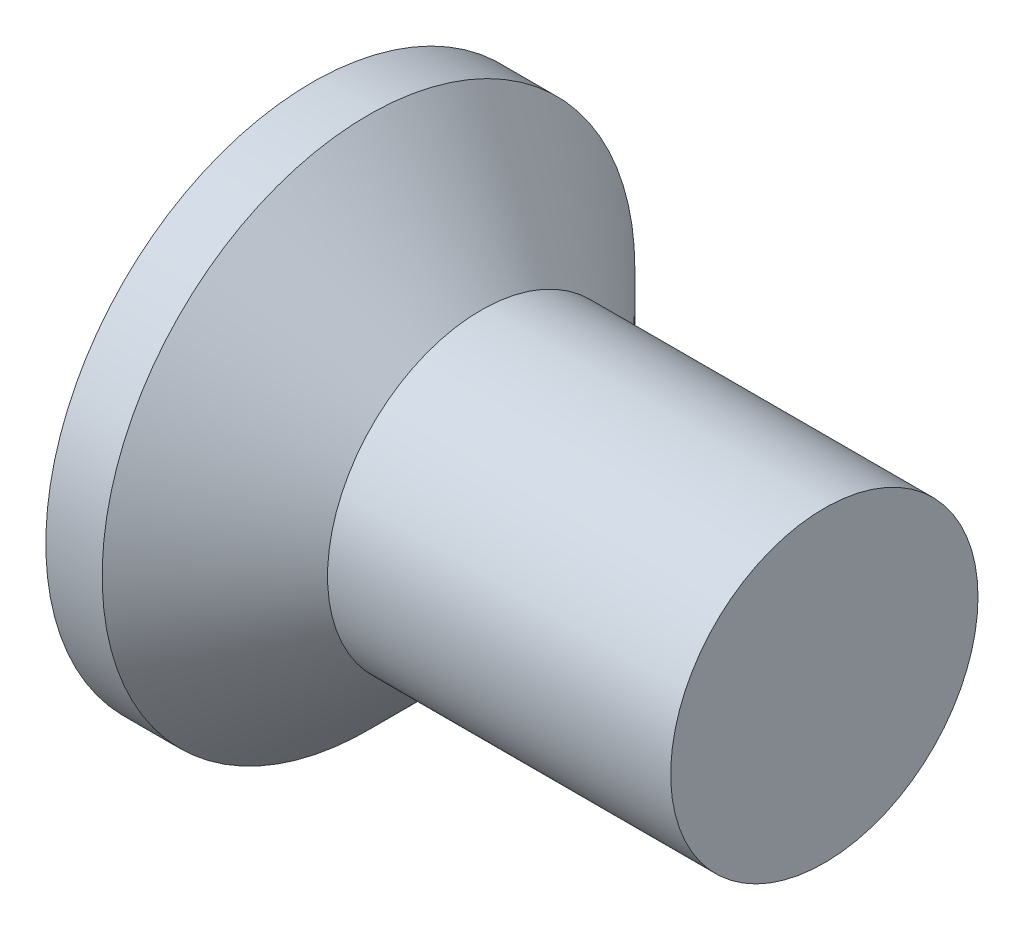
ISO-10303-21;
HEADER;
FILE_DESCRIPTION(('STEP AP214'),'2;1');
FILE_NAME('part.step','',(''),(''),'','','');
FILE_SCHEMA(('AUTOMOTIVE_DESIGN { 1 0 10303 214 1 1 1 1 }'));
ENDSEC;
DATA;
#1=APPLICATION_CONTEXT('core data for automotive mechanical design processes');
#2=APPLICATION_PROTOCOL_DEFINITION('international standard','automotive_design',2000,#1);
#3=PRODUCT_CONTEXT('',#1,'mechanical');
#4=PRODUCT('Part','Part','',(#3));
#5=PRODUCT_RELATED_PRODUCT_CATEGORY('part','',(#4));
#6=PRODUCT_DEFINITION_FORMATION('','',#4);
#7=PRODUCT_DEFINITION_CONTEXT('part definition',#1,'design');
#8=PRODUCT_DEFINITION('design','',#6,#7);
#9=PRODUCT_DEFINITION_SHAPE('','',#8);
#10=(LENGTH_UNIT() NAMED_UNIT(*) SI_UNIT(.MILLI.,.METRE.));
#11=(NAMED_UNIT(*) PLANE_ANGLE_UNIT() SI_UNIT($,.RADIAN.));
#12=(NAMED_UNIT(*) SI_UNIT($,.STERADIAN.) SOLID_ANGLE_UNIT());
#13=UNCERTAINTY_MEASURE_WITH_UNIT(LENGTH_MEASURE(1.E-05),#10,'distance_accuracy_value','');
#14=(GEOMETRIC_REPRESENTATION_CONTEXT(3) GLOBAL_UNCERTAINTY_ASSIGNED_CONTEXT((#13)) GLOBAL_UNIT_ASSIGNED_CONTEXT((#10,
#11,#12)) REPRESENTATION_CONTEXT('',''));
#15=CARTESIAN_POINT('',(0.,0.,0.));
#16=DIRECTION('',(0.,0.,1.));
#17=DIRECTION('',(1.,0.,0.));
#18=AXIS2_PLACEMENT_3D('',#15,#16,#17);
#19=CARTESIAN_POINT('',(0.825,0.62,0.62));
#20=DIRECTION('',(-1.,0.,0.));
#21=DIRECTION('',(0.,0.,1.));
#22=AXIS2_PLACEMENT_3D('',#19,#20,#21);
#23=CYLINDRICAL_SURFACE('',#22,0.3);
#24=CARTESIAN_POINT('',(0.825,0.62,0.62));
#25=DIRECTION('',(1.,0.,0.));
#26=DIRECTION('',(0.,0.,1.));
#27=AXIS2_PLACEMENT_3D('',#24,#25,#26);
#28=CIRCLE('',#27,0.3);
#29=CARTESIAN_POINT('',(0.825,0.32,0.62));
#30=VERTEX_POINT('',#29);
#31=CARTESIAN_POINT('',(0.825,0.62,0.32));
#32=VERTEX_POINT('',#31);
#33=EDGE_CURVE('E39',#30,#32,#28,.T.);
#34=ORIENTED_EDGE('',*,*,#33,.F.);
#35=DIRECTION('',(1.,0.,0.));
#36=VECTOR('',#35,1.);
#37=CARTESIAN_POINT('',(0.825,0.32,0.62));
#38=LINE('',#37,#36);
#39=CARTESIAN_POINT('',(0.,0.32,0.62));
#40=VERTEX_POINT('',#39);
#41=EDGE_CURVE('E224',#40,#30,#38,.T.);
#42=ORIENTED_EDGE('',*,*,#41,.F.);
#43=CARTESIAN_POINT('',(0.,0.62,0.62));
#44=DIRECTION('',(-1.,0.,0.));
#45=DIRECTION('',(0.,0.,1.));
#46=AXIS2_PLACEMENT_3D('',#43,#44,#45);
#47=CIRCLE('',#46,0.3);
#48=CARTESIAN_POINT('',(0.,0.62,0.32));
#49=VERTEX_POINT('',#48);
#50=EDGE_CURVE('E326',#49,#40,#47,.T.);
#51=ORIENTED_EDGE('',*,*,#50,.F.);
#52=DIRECTION('',(-1.,0.,0.));
#53=VECTOR('',#52,1.);
#54=CARTESIAN_POINT('',(0.825,0.62,0.32));
#55=LINE('',#54,#53);
#56=EDGE_CURVE('E198',#32,#49,#55,.T.);
#57=ORIENTED_EDGE('',*,*,#56,.F.);
#58=EDGE_LOOP('',(#34,#42,#51,#57));
#59=FACE_BOUND('',#58,.T.);
#60=ADVANCED_FACE('F17',(#59),#23,.T.);
#61=CARTESIAN_POINT('',(0.825,0.62,-0.62));
#62=DIRECTION('',(-1.,0.,0.));
#63=DIRECTION('',(0.,0.,1.));
#64=AXIS2_PLACEMENT_3D('',#61,#62,#63);
#65=CYLINDRICAL_SURFACE('',#64,0.3);
#66=CARTESIAN_POINT('',(0.825,0.62,-0.62));
#67=DIRECTION('',(1.,0.,0.));
#68=DIRECTION('',(0.,0.,1.));
#69=AXIS2_PLACEMENT_3D('',#66,#67,#68);
#70=CIRCLE('',#69,0.3);
#71=CARTESIAN_POINT('',(0.825,0.62,-0.32));
#72=VERTEX_POINT('',#71);
#73=CARTESIAN_POINT('',(0.825,0.32,-0.62));
#74=VERTEX_POINT('',#73);
#75=EDGE_CURVE('E202',#72,#74,#70,.T.);
#76=ORIENTED_EDGE('',*,*,#75,.F.);
#77=DIRECTION('',(1.,0.,0.));
#78=VECTOR('',#77,1.);
#79=CARTESIAN_POINT('',(0.825,0.62,-0.32));
#80=LINE('',#79,#78);
#81=CARTESIAN_POINT('',(0.,0.62,-0.32));
#82=VERTEX_POINT('',#81);
#83=EDGE_CURVE('E186',#82,#72,#80,.T.);
#84=ORIENTED_EDGE('',*,*,#83,.F.);
#85=CARTESIAN_POINT('',(0.,0.62,-0.62));
#86=DIRECTION('',(-1.,0.,0.));
#87=DIRECTION('',(0.,0.,1.));
#88=AXIS2_PLACEMENT_3D('',#85,#86,#87);
#89=CIRCLE('',#88,0.3);
#90=CARTESIAN_POINT('',(0.,0.32,-0.62));
#91=VERTEX_POINT('',#90);
#92=EDGE_CURVE('E304',#91,#82,#89,.T.);
#93=ORIENTED_EDGE('',*,*,#92,.F.);
#94=DIRECTION('',(-1.,0.,0.));
#95=VECTOR('',#94,1.);
#96=CARTESIAN_POINT('',(0.825,0.32,-0.62));
#97=LINE('',#96,#95);
#98=EDGE_CURVE('E192',#74,#91,#97,.T.);
#99=ORIENTED_EDGE('',*,*,#98,.F.);
#100=EDGE_LOOP('',(#76,#84,#93,#99));
#101=FACE_BOUND('',#100,.T.);
#102=ADVANCED_FACE('F390',(#101),#65,.T.);
#103=CARTESIAN_POINT('',(0.825,-0.62,0.62));
#104=DIRECTION('',(-1.,0.,0.));
#105=DIRECTION('',(0.,0.,1.));
#106=AXIS2_PLACEMENT_3D('',#103,#104,#105);
#107=CYLINDRICAL_SURFACE('',#106,0.3);
#108=CARTESIAN_POINT('',(0.825,-0.62,0.62));
#109=DIRECTION('',(1.,0.,0.));
#110=DIRECTION('',(0.,0.,1.));
#111=AXIS2_PLACEMENT_3D('',#108,#109,#110);
#112=CIRCLE('',#111,0.3);
#113=CARTESIAN_POINT('',(0.825,-0.62,0.32));
#114=VERTEX_POINT('',#113);
#115=CARTESIAN_POINT('',(0.825,-0.32,0.62));
#116=VERTEX_POINT('',#115);
#117=EDGE_CURVE('E11',#114,#116,#112,.T.);
#118=ORIENTED_EDGE('',*,*,#117,.F.);
#119=DIRECTION('',(1.,0.,0.));
#120=VECTOR('',#119,1.);
#121=CARTESIAN_POINT('',(0.825,-0.62,0.32));
#122=LINE('',#121,#120);
#123=CARTESIAN_POINT('',(0.,-0.62,0.32));
#124=VERTEX_POINT('',#123);
#125=EDGE_CURVE('E236',#124,#114,#122,.T.);
#126=ORIENTED_EDGE('',*,*,#125,.F.);
#127=CARTESIAN_POINT('',(0.,-0.62,0.62));
#128=DIRECTION('',(-1.,0.,0.));
#129=DIRECTION('',(0.,0.,1.));
#130=AXIS2_PLACEMENT_3D('',#127,#128,#129);
#131=CIRCLE('',#130,0.3);
#132=CARTESIAN_POINT('',(0.,-0.32,0.62));
#133=VERTEX_POINT('',#132);
#134=EDGE_CURVE('E358',#133,#124,#131,.T.);
#135=ORIENTED_EDGE('',*,*,#134,.F.);
#136=DIRECTION('',(-1.,0.,0.));
#137=VECTOR('',#136,1.);
#138=CARTESIAN_POINT('',(0.825,-0.32,0.62));
#139=LINE('',#138,#137);
#140=EDGE_CURVE('E233',#116,#133,#139,.T.);
#141=ORIENTED_EDGE('',*,*,#140,.F.);
#142=EDGE_LOOP('',(#118,#126,#135,#141));
#143=FACE_BOUND('',#142,.T.);
#144=ADVANCED_FACE('F392',(#143),#107,.T.);
#145=CARTESIAN_POINT('',(0.825,-0.62,-0.62));
#146=DIRECTION('',(-1.,0.,0.));
#147=DIRECTION('',(0.,0.,1.));
#148=AXIS2_PLACEMENT_3D('',#145,#146,#147);
#149=CYLINDRICAL_SURFACE('',#148,0.3);
#150=CARTESIAN_POINT('',(0.825,-0.62,-0.62));
#151=DIRECTION('',(1.,0.,0.));
#152=DIRECTION('',(0.,0.,1.));
#153=AXIS2_PLACEMENT_3D('',#150,#151,#152);
#154=CIRCLE('',#153,0.3);
#155=CARTESIAN_POINT('',(0.825,-0.32,-0.62));
#156=VERTEX_POINT('',#155);
#157=CARTESIAN_POINT('',(0.825,-0.62,-0.32));
#158=VERTEX_POINT('',#157);
#159=EDGE_CURVE('E26',#156,#158,#154,.T.);
#160=ORIENTED_EDGE('',*,*,#159,.F.);
#161=DIRECTION('',(1.,0.,0.));
#162=VECTOR('',#161,1.);
#163=CARTESIAN_POINT('',(0.825,-0.32,-0.62));
#164=LINE('',#163,#162);
#165=CARTESIAN_POINT('',(0.,-0.32,-0.62));
#166=VERTEX_POINT('',#165);
#167=EDGE_CURVE('E219',#166,#156,#164,.T.);
#168=ORIENTED_EDGE('',*,*,#167,.F.);
#169=CARTESIAN_POINT('',(0.,-0.62,-0.62));
#170=DIRECTION('',(-1.,0.,0.));
#171=DIRECTION('',(0.,0.,1.));
#172=AXIS2_PLACEMENT_3D('',#169,#170,#171);
#173=CIRCLE('',#172,0.3);
#174=CARTESIAN_POINT('',(0.,-0.62,-0.32));
#175=VERTEX_POINT('',#174);
#176=EDGE_CURVE('E312',#175,#166,#173,.T.);
#177=ORIENTED_EDGE('',*,*,#176,.F.);
#178=DIRECTION('',(-1.,0.,0.));
#179=VECTOR('',#178,1.);
#180=CARTESIAN_POINT('',(0.825,-0.62,-0.32));
#181=LINE('',#180,#179);
#182=EDGE_CURVE('E223',#158,#175,#181,.T.);
#183=ORIENTED_EDGE('',*,*,#182,.F.);
#184=EDGE_LOOP('',(#160,#168,#177,#183));
#185=FACE_BOUND('',#184,.T.);
#186=ADVANCED_FACE('F398',(#185),#149,.T.);
#187=CARTESIAN_POINT('',(0.825,0.32,0.32));
#188=DIRECTION('',(-1.,0.,0.));
#189=DIRECTION('',(0.,0.,1.));
#190=AXIS2_PLACEMENT_3D('',#187,#188,#189);
#191=PLANE('',#190);
#192=DIRECTION('',(0.,0.,1.));
#193=VECTOR('',#192,1.);
#194=CARTESIAN_POINT('',(0.825,0.32,0.32));
#195=LINE('',#194,#193);
#196=CARTESIAN_POINT('',(0.825,0.32,1.12368602791856));
#197=VERTEX_POINT('',#196);
#198=EDGE_CURVE('E228',#30,#197,#195,.T.);
#199=ORIENTED_EDGE('',*,*,#198,.F.);
#200=ORIENTED_EDGE('',*,*,#33,.T.);
#201=DIRECTION('',(0.,-1.,0.));
#202=VECTOR('',#201,1.);
#203=CARTESIAN_POINT('',(0.825,0.32,0.32));
#204=LINE('',#203,#202);
#205=CARTESIAN_POINT('',(0.825,1.12368602791856,0.32));
#206=VERTEX_POINT('',#205);
#207=EDGE_CURVE('E169',#206,#32,#204,.T.);
#208=ORIENTED_EDGE('',*,*,#207,.F.);
#209=DIRECTION('',(0.,0.,1.));
#210=VECTOR('',#209,1.);
#211=CARTESIAN_POINT('',(0.825,1.12368602791856,0.32));
#212=LINE('',#211,#210);
#213=CARTESIAN_POINT('',(0.825,1.12368602791856,-0.32));
#214=VERTEX_POINT('',#213);
#215=EDGE_CURVE('E162',#214,#206,#212,.T.);
#216=ORIENTED_EDGE('',*,*,#215,.F.);
#217=DIRECTION('',(0.,1.,0.));
#218=VECTOR('',#217,1.);
#219=CARTESIAN_POINT('',(0.825,0.32,-0.32));
#220=LINE('',#219,#218);
#221=EDGE_CURVE('E166',#72,#214,#220,.T.);
#222=ORIENTED_EDGE('',*,*,#221,.F.);
#223=ORIENTED_EDGE('',*,*,#75,.T.);
#224=DIRECTION('',(0.,0.,1.));
#225=VECTOR('',#224,1.);
#226=CARTESIAN_POINT('',(0.825,0.32,-0.32));
#227=LINE('',#226,#225);
#228=CARTESIAN_POINT('',(0.825,0.32,-1.12368602791856));
#229=VERTEX_POINT('',#228);
#230=EDGE_CURVE('E281',#229,#74,#227,.T.);
#231=ORIENTED_EDGE('',*,*,#230,.F.);
#232=DIRECTION('',(0.,1.,0.));
#233=VECTOR('',#232,1.);
#234=CARTESIAN_POINT('',(0.825,0.32,-1.12368602791856));
#235=LINE('',#234,#233);
#236=CARTESIAN_POINT('',(0.825,-0.32,-1.12368602791856));
#237=VERTEX_POINT('',#236);
#238=EDGE_CURVE('E276',#237,#229,#235,.T.);
#239=ORIENTED_EDGE('',*,*,#238,.F.);
#240=DIRECTION('',(0.,0.,-1.));
#241=VECTOR('',#240,1.);
#242=CARTESIAN_POINT('',(0.825,-0.32,-0.32));
#243=LINE('',#242,#241);
#244=EDGE_CURVE('E222',#156,#237,#243,.T.);
#245=ORIENTED_EDGE('',*,*,#244,.F.);
#246=ORIENTED_EDGE('',*,*,#159,.T.);
#247=DIRECTION('',(0.,1.,0.));
#248=VECTOR('',#247,1.);
#249=CARTESIAN_POINT('',(0.825,-0.32,-0.32));
#250=LINE('',#249,#248);
#251=CARTESIAN_POINT('',(0.825,-1.12368602791856,-0.32));
#252=VERTEX_POINT('',#251);
#253=EDGE_CURVE('E264',#252,#158,#250,.T.);
#254=ORIENTED_EDGE('',*,*,#253,.F.);
#255=DIRECTION('',(0.,0.,-1.));
#256=VECTOR('',#255,1.);
#257=CARTESIAN_POINT('',(0.825,-1.12368602791856,0.32));
#258=LINE('',#257,#256);
#259=CARTESIAN_POINT('',(0.825,-1.12368602791856,0.32));
#260=VERTEX_POINT('',#259);
#261=EDGE_CURVE('E257',#260,#252,#258,.T.);
#262=ORIENTED_EDGE('',*,*,#261,.F.);
#263=DIRECTION('',(0.,-1.,0.));
#264=VECTOR('',#263,1.);
#265=CARTESIAN_POINT('',(0.825,-0.32,0.32));
#266=LINE('',#265,#264);
#267=EDGE_CURVE('E250',#114,#260,#266,.T.);
#268=ORIENTED_EDGE('',*,*,#267,.F.);
#269=ORIENTED_EDGE('',*,*,#117,.T.);
#270=DIRECTION('',(0.,0.,-1.));
#271=VECTOR('',#270,1.);
#272=CARTESIAN_POINT('',(0.825,-0.32,0.32));
#273=LINE('',#272,#271);
#274=CARTESIAN_POINT('',(0.825,-0.32,1.12368602791856));
#275=VERTEX_POINT('',#274);
#276=EDGE_CURVE('E237',#275,#116,#273,.T.);
#277=ORIENTED_EDGE('',*,*,#276,.F.);
#278=DIRECTION('',(0.,-1.,0.));
#279=VECTOR('',#278,1.);
#280=CARTESIAN_POINT('',(0.825,0.32,1.12368602791856));
#281=LINE('',#280,#279);
#282=EDGE_CURVE('E232',#197,#275,#281,.T.);
#283=ORIENTED_EDGE('',*,*,#282,.F.);
#284=EDGE_LOOP('',(#199,#200,#208,#216,#222,#223,#231,#239,#245,#246,#254,#262,#268,#269,#277,#283));
#285=FACE_BOUND('',#284,.T.);
#286=ADVANCED_FACE('F164',(#285),#191,.T.);
#287=CARTESIAN_POINT('',(0.825,0.32,0.32));
#288=DIRECTION('',(0.,0.,-1.));
#289=DIRECTION('',(-1.,0.,0.));
#290=AXIS2_PLACEMENT_3D('',#287,#288,#289);
#291=PLANE('',#290);
#292=ORIENTED_EDGE('',*,*,#207,.T.);
#293=ORIENTED_EDGE('',*,*,#56,.T.);
#294=DIRECTION('',(0.,-1.,0.));
#295=VECTOR('',#294,1.);
#296=CARTESIAN_POINT('',(0.,0.32,0.32));
#297=LINE('',#296,#295);
#298=CARTESIAN_POINT('',(0.,1.6,0.32));
#299=VERTEX_POINT('',#298);
#300=EDGE_CURVE('E344',#299,#49,#297,.T.);
#301=ORIENTED_EDGE('',*,*,#300,.F.);
#302=DIRECTION('',(-0.866025403784438,0.5,0.));
#303=VECTOR('',#302,1.);
#304=CARTESIAN_POINT('',(1.17300625842204,0.922764520938917,0.32));
#305=LINE('',#304,#303);
#306=EDGE_CURVE('E173',#206,#299,#305,.T.);
#307=ORIENTED_EDGE('',*,*,#306,.F.);
#308=EDGE_LOOP('',(#292,#293,#301,#307));
#309=FACE_BOUND('',#308,.T.);
#310=ADVANCED_FACE('F388',(#309),#291,.T.);
#311=CARTESIAN_POINT('',(0.,1.6,-0.32));
#312=DIRECTION('',(-0.5,-0.866025403784438,0.));
#313=DIRECTION('',(-0.866025403784438,0.5,0.));
#314=AXIS2_PLACEMENT_3D('',#311,#312,#313);
#315=PLANE('',#314);
#316=DIRECTION('',(0.,0.,1.));
#317=VECTOR('',#316,1.);
#318=CARTESIAN_POINT('',(0.,1.6,-0.32));
#319=LINE('',#318,#317);
#320=CARTESIAN_POINT('',(0.,1.6,-0.32));
#321=VERTEX_POINT('',#320);
#322=EDGE_CURVE('E179',#321,#299,#319,.T.);
#323=ORIENTED_EDGE('',*,*,#322,.F.);
#324=DIRECTION('',(-0.866025403784438,0.5,0.));
#325=VECTOR('',#324,1.);
#326=CARTESIAN_POINT('',(0.,1.6,-0.32));
#327=LINE('',#326,#325);
#328=EDGE_CURVE('E174',#214,#321,#327,.T.);
#329=ORIENTED_EDGE('',*,*,#328,.F.);
#330=ORIENTED_EDGE('',*,*,#215,.T.);
#331=ORIENTED_EDGE('',*,*,#306,.T.);
#332=EDGE_LOOP('',(#323,#329,#330,#331));
#333=FACE_BOUND('',#332,.T.);
#334=ADVANCED_FACE('F177',(#333),#315,.T.);
#335=CARTESIAN_POINT('',(0.825,0.32,-0.32));
#336=DIRECTION('',(0.,0.,1.));
#337=DIRECTION('',(1.,0.,0.));
#338=AXIS2_PLACEMENT_3D('',#335,#336,#337);
#339=PLANE('',#338);
#340=DIRECTION('',(0.,1.,0.));
#341=VECTOR('',#340,1.);
#342=CARTESIAN_POINT('',(0.,0.32,-0.32));
#343=LINE('',#342,#341);
#344=EDGE_CURVE('E339',#82,#321,#343,.T.);
#345=ORIENTED_EDGE('',*,*,#344,.F.);
#346=ORIENTED_EDGE('',*,*,#83,.T.);
#347=ORIENTED_EDGE('',*,*,#221,.T.);
#348=ORIENTED_EDGE('',*,*,#328,.T.);
#349=EDGE_LOOP('',(#345,#346,#347,#348));
#350=FACE_BOUND('',#349,.T.);
#351=ADVANCED_FACE('F185',(#350),#339,.T.);
#352=CARTESIAN_POINT('',(0.825,0.32,-0.32));
#353=DIRECTION('',(0.,-1.,0.));
#354=DIRECTION('',(0.,0.,-1.));
#355=AXIS2_PLACEMENT_3D('',#352,#353,#354);
#356=PLANE('',#355);
#357=ORIENTED_EDGE('',*,*,#230,.T.);
#358=ORIENTED_EDGE('',*,*,#98,.T.);
#359=DIRECTION('',(0.,0.,1.));
#360=VECTOR('',#359,1.);
#361=CARTESIAN_POINT('',(0.,0.32,-0.32));
#362=LINE('',#361,#360);
#363=CARTESIAN_POINT('',(0.,0.32,-1.6));
#364=VERTEX_POINT('',#363);
#365=EDGE_CURVE('E301',#364,#91,#362,.T.);
#366=ORIENTED_EDGE('',*,*,#365,.F.);
#367=DIRECTION('',(-0.866025403784438,0.,-0.5));
#368=VECTOR('',#367,1.);
#369=CARTESIAN_POINT('',(1.17300625842204,0.32,-0.922764520938917));
#370=LINE('',#369,#368);
#371=EDGE_CURVE('E279',#229,#364,#370,.T.);
#372=ORIENTED_EDGE('',*,*,#371,.F.);
#373=EDGE_LOOP('',(#357,#358,#366,#372));
#374=FACE_BOUND('',#373,.T.);
#375=ADVANCED_FACE('F413',(#374),#356,.T.);
#376=CARTESIAN_POINT('',(0.,0.32,-1.6));
#377=DIRECTION('',(-0.5,0.,0.866025403784438));
#378=DIRECTION('',(0.,1.,0.));
#379=AXIS2_PLACEMENT_3D('',#376,#377,#378);
#380=PLANE('',#379);
#381=DIRECTION('',(0.,1.,0.));
#382=VECTOR('',#381,1.);
#383=CARTESIAN_POINT('',(0.,0.32,-1.6));
#384=LINE('',#383,#382);
#385=CARTESIAN_POINT('',(0.,-0.32,-1.6));
#386=VERTEX_POINT('',#385);
#387=EDGE_CURVE('E305',#386,#364,#384,.T.);
#388=ORIENTED_EDGE('',*,*,#387,.F.);
#389=DIRECTION('',(-0.866025403784438,0.,-0.5));
#390=VECTOR('',#389,1.);
#391=CARTESIAN_POINT('',(0.,-0.32,-1.6));
#392=LINE('',#391,#390);
#393=EDGE_CURVE('E273',#237,#386,#392,.T.);
#394=ORIENTED_EDGE('',*,*,#393,.F.);
#395=ORIENTED_EDGE('',*,*,#238,.T.);
#396=ORIENTED_EDGE('',*,*,#371,.T.);
#397=EDGE_LOOP('',(#388,#394,#395,#396));
#398=FACE_BOUND('',#397,.T.);
#399=ADVANCED_FACE('F416',(#398),#380,.T.);
#400=CARTESIAN_POINT('',(0.825,-0.32,-0.32));
#401=DIRECTION('',(0.,1.,0.));
#402=DIRECTION('',(1.,0.,0.));
#403=AXIS2_PLACEMENT_3D('',#400,#401,#402);
#404=PLANE('',#403);
#405=DIRECTION('',(0.,0.,-1.));
#406=VECTOR('',#405,1.);
#407=CARTESIAN_POINT('',(0.,-0.32,-0.32));
#408=LINE('',#407,#406);
#409=EDGE_CURVE('E316',#166,#386,#408,.T.);
#410=ORIENTED_EDGE('',*,*,#409,.F.);
#411=ORIENTED_EDGE('',*,*,#167,.T.);
#412=ORIENTED_EDGE('',*,*,#244,.T.);
#413=ORIENTED_EDGE('',*,*,#393,.T.);
#414=EDGE_LOOP('',(#410,#411,#412,#413));
#415=FACE_BOUND('',#414,.T.);
#416=ADVANCED_FACE('F421',(#415),#404,.T.);
#417=CARTESIAN_POINT('',(0.825,-0.32,-0.32));
#418=DIRECTION('',(0.,0.,1.));
#419=DIRECTION('',(1.,0.,0.));
#420=AXIS2_PLACEMENT_3D('',#417,#418,#419);
#421=PLANE('',#420);
#422=ORIENTED_EDGE('',*,*,#253,.T.);
#423=ORIENTED_EDGE('',*,*,#182,.T.);
#424=DIRECTION('',(0.,1.,0.));
#425=VECTOR('',#424,1.);
#426=CARTESIAN_POINT('',(0.,-0.32,-0.32));
#427=LINE('',#426,#425);
#428=CARTESIAN_POINT('',(0.,-1.6,-0.32));
#429=VERTEX_POINT('',#428);
#430=EDGE_CURVE('E299',#429,#175,#427,.T.);
#431=ORIENTED_EDGE('',*,*,#430,.F.);
#432=DIRECTION('',(-0.866025403784438,-0.5,0.));
#433=VECTOR('',#432,1.);
#434=CARTESIAN_POINT('',(1.17300625842204,-0.922764520938917,-0.32));
#435=LINE('',#434,#433);
#436=EDGE_CURVE('E260',#252,#429,#435,.T.);
#437=ORIENTED_EDGE('',*,*,#436,.F.);
#438=EDGE_LOOP('',(#422,#423,#431,#437));
#439=FACE_BOUND('',#438,.T.);
#440=ADVANCED_FACE('F417',(#439),#421,.T.);
#441=CARTESIAN_POINT('',(0.,-1.6,-0.32));
#442=DIRECTION('',(-0.5,0.866025403784438,0.));
#443=DIRECTION('',(0.,0.,1.));
#444=AXIS2_PLACEMENT_3D('',#441,#442,#443);
#445=PLANE('',#444);
#446=DIRECTION('',(0.,0.,-1.));
#447=VECTOR('',#446,1.);
#448=CARTESIAN_POINT('',(0.,-1.6,-0.32));
#449=LINE('',#448,#447);
#450=CARTESIAN_POINT('',(0.,-1.6,0.32));
#451=VERTEX_POINT('',#450);
#452=EDGE_CURVE('E217',#451,#429,#449,.T.);
#453=ORIENTED_EDGE('',*,*,#452,.F.);
#454=DIRECTION('',(-0.866025403784438,-0.5,0.));
#455=VECTOR('',#454,1.);
#456=CARTESIAN_POINT('',(0.,-1.6,0.32));
#457=LINE('',#456,#455);
#458=EDGE_CURVE('E254',#260,#451,#457,.T.);
#459=ORIENTED_EDGE('',*,*,#458,.F.);
#460=ORIENTED_EDGE('',*,*,#261,.T.);
#461=ORIENTED_EDGE('',*,*,#436,.T.);
#462=EDGE_LOOP('',(#453,#459,#460,#461));
#463=FACE_BOUND('',#462,.T.);
#464=ADVANCED_FACE('F420',(#463),#445,.T.);
#465=CARTESIAN_POINT('',(0.825,-0.32,0.32));
#466=DIRECTION('',(0.,0.,-1.));
#467=DIRECTION('',(0.,-1.,0.));
#468=AXIS2_PLACEMENT_3D('',#465,#466,#467);
#469=PLANE('',#468);
#470=DIRECTION('',(0.,-1.,0.));
#471=VECTOR('',#470,1.);
#472=CARTESIAN_POINT('',(0.,-0.32,0.32));
#473=LINE('',#472,#471);
#474=EDGE_CURVE('E364',#124,#451,#473,.T.);
#475=ORIENTED_EDGE('',*,*,#474,.F.);
#476=ORIENTED_EDGE('',*,*,#125,.T.);
#477=ORIENTED_EDGE('',*,*,#267,.T.);
#478=ORIENTED_EDGE('',*,*,#458,.T.);
#479=EDGE_LOOP('',(#475,#476,#477,#478));
#480=FACE_BOUND('',#479,.T.);
#481=ADVANCED_FACE('F423',(#480),#469,.T.);
#482=CARTESIAN_POINT('',(0.825,-0.32,0.32));
#483=DIRECTION('',(0.,1.,0.));
#484=DIRECTION('',(0.,0.,-1.));
#485=AXIS2_PLACEMENT_3D('',#482,#483,#484);
#486=PLANE('',#485);
#487=ORIENTED_EDGE('',*,*,#276,.T.);
#488=ORIENTED_EDGE('',*,*,#140,.T.);
#489=DIRECTION('',(0.,0.,-1.));
#490=VECTOR('',#489,1.);
#491=CARTESIAN_POINT('',(0.,-0.32,0.32));
#492=LINE('',#491,#490);
#493=CARTESIAN_POINT('',(0.,-0.32,1.6));
#494=VERTEX_POINT('',#493);
#495=EDGE_CURVE('E354',#494,#133,#492,.T.);
#496=ORIENTED_EDGE('',*,*,#495,.F.);
#497=DIRECTION('',(-0.866025403784438,0.,0.5));
#498=VECTOR('',#497,1.);
#499=CARTESIAN_POINT('',(1.17300625842204,-0.32,0.922764520938917));
#500=LINE('',#499,#498);
#501=EDGE_CURVE('E241',#275,#494,#500,.T.);
#502=ORIENTED_EDGE('',*,*,#501,.F.);
#503=EDGE_LOOP('',(#487,#488,#496,#502));
#504=FACE_BOUND('',#503,.T.);
#505=ADVANCED_FACE('F426',(#504),#486,.T.);
#506=CARTESIAN_POINT('',(0.,0.32,1.6));
#507=DIRECTION('',(-0.5,0.,-0.866025403784438));
#508=DIRECTION('',(-0.866025403784438,0.,0.5));
#509=AXIS2_PLACEMENT_3D('',#506,#507,#508);
#510=PLANE('',#509);
#511=DIRECTION('',(0.,-1.,0.));
#512=VECTOR('',#511,1.);
#513=CARTESIAN_POINT('',(0.,0.32,1.6));
#514=LINE('',#513,#512);
#515=CARTESIAN_POINT('',(0.,0.32,1.6));
#516=VERTEX_POINT('',#515);
#517=EDGE_CURVE('E325',#516,#494,#514,.T.);
#518=ORIENTED_EDGE('',*,*,#517,.F.);
#519=DIRECTION('',(-0.866025403784438,0.,0.5));
#520=VECTOR('',#519,1.);
#521=CARTESIAN_POINT('',(0.,0.32,1.6));
#522=LINE('',#521,#520);
#523=EDGE_CURVE('E229',#197,#516,#522,.T.);
#524=ORIENTED_EDGE('',*,*,#523,.F.);
#525=ORIENTED_EDGE('',*,*,#282,.T.);
#526=ORIENTED_EDGE('',*,*,#501,.T.);
#527=EDGE_LOOP('',(#518,#524,#525,#526));
#528=FACE_BOUND('',#527,.T.);
#529=ADVANCED_FACE('F378',(#528),#510,.T.);
#530=CARTESIAN_POINT('',(0.825,0.32,0.32));
#531=DIRECTION('',(0.,-1.,0.));
#532=DIRECTION('',(0.,0.,-1.));
#533=AXIS2_PLACEMENT_3D('',#530,#531,#532);
#534=PLANE('',#533);
#535=DIRECTION('',(0.,0.,1.));
#536=VECTOR('',#535,1.);
#537=CARTESIAN_POINT('',(0.,0.32,0.32));
#538=LINE('',#537,#536);
#539=EDGE_CURVE('E321',#40,#516,#538,.T.);
#540=ORIENTED_EDGE('',*,*,#539,.F.);
#541=ORIENTED_EDGE('',*,*,#41,.T.);
#542=ORIENTED_EDGE('',*,*,#198,.T.);
#543=ORIENTED_EDGE('',*,*,#523,.T.);
#544=EDGE_LOOP('',(#540,#541,#542,#543));
#545=FACE_BOUND('',#544,.T.);
#546=ADVANCED_FACE('F373',(#545),#534,.T.);
#547=CARTESIAN_POINT('',(5.,1.5,0.));
#548=DIRECTION('',(1.,0.,0.));
#549=DIRECTION('',(0.,1.,0.));
#550=AXIS2_PLACEMENT_3D('',#547,#548,#549);
#551=PLANE('',#550);
#552=CARTESIAN_POINT('',(5.,0.,0.));
#553=DIRECTION('',(1.,0.,0.));
#554=DIRECTION('',(0.,0.,-1.));
#555=AXIS2_PLACEMENT_3D('',#552,#553,#554);
#556=CIRCLE('',#555,1.5);
#557=CARTESIAN_POINT('',(5.,0.,-1.5));
#558=VERTEX_POINT('',#557);
#559=EDGE_CURVE('E306',#558,#558,#556,.T.);
#560=ORIENTED_EDGE('',*,*,#559,.T.);
#561=EDGE_LOOP('',(#560));
#562=FACE_BOUND('',#561,.T.);
#563=ADVANCED_FACE('F442',(#562),#551,.T.);
#564=CARTESIAN_POINT('',(0.,2.6,0.));
#565=DIRECTION('',(-1.,0.,0.));
#566=DIRECTION('',(0.,0.,1.));
#567=AXIS2_PLACEMENT_3D('',#564,#565,#566);
#568=PLANE('',#567);
#569=ORIENTED_EDGE('',*,*,#430,.T.);
#570=ORIENTED_EDGE('',*,*,#176,.T.);
#571=ORIENTED_EDGE('',*,*,#409,.T.);
#572=ORIENTED_EDGE('',*,*,#387,.T.);
#573=ORIENTED_EDGE('',*,*,#365,.T.);
#574=ORIENTED_EDGE('',*,*,#92,.T.);
#575=ORIENTED_EDGE('',*,*,#344,.T.);
#576=ORIENTED_EDGE('',*,*,#322,.T.);
#577=ORIENTED_EDGE('',*,*,#300,.T.);
#578=ORIENTED_EDGE('',*,*,#50,.T.);
#579=ORIENTED_EDGE('',*,*,#539,.T.);
#580=ORIENTED_EDGE('',*,*,#517,.T.);
#581=ORIENTED_EDGE('',*,*,#495,.T.);
#582=ORIENTED_EDGE('',*,*,#134,.T.);
#583=ORIENTED_EDGE('',*,*,#474,.T.);
#584=ORIENTED_EDGE('',*,*,#452,.T.);
#585=EDGE_LOOP('',(#569,#570,#571,#572,#573,#574,#575,#576,#577,#578,#579,#580,#581,#582,#583,#584));
#586=FACE_BOUND('',#585,.T.);
#587=CARTESIAN_POINT('',(0.,0.,0.));
#588=DIRECTION('',(1.,0.,0.));
#589=DIRECTION('',(0.,0.,-1.));
#590=AXIS2_PLACEMENT_3D('',#587,#588,#589);
#591=CIRCLE('',#590,2.6);
#592=CARTESIAN_POINT('',(0.,0.,-2.6));
#593=VERTEX_POINT('',#592);
#594=EDGE_CURVE('E319',#593,#593,#591,.T.);
#595=ORIENTED_EDGE('',*,*,#594,.F.);
#596=EDGE_LOOP('',(#595));
#597=FACE_BOUND('',#596,.T.);
#598=ADVANCED_FACE('F382',(#586,#597),#568,.T.);
#599=CARTESIAN_POINT('',(4.51581291088132,0.,0.));
#600=DIRECTION('',(1.,0.,0.));
#601=DIRECTION('',(0.,0.,-1.));
#602=AXIS2_PLACEMENT_3D('',#599,#600,#601);
#603=CYLINDRICAL_SURFACE('',#602,2.6);
#604=CARTESIAN_POINT('',(0.55,0.,0.));
#605=DIRECTION('',(1.,0.,0.));
#606=DIRECTION('',(0.,0.,-1.));
#607=AXIS2_PLACEMENT_3D('',#604,#605,#606);
#608=CIRCLE('',#607,2.6);
#609=CARTESIAN_POINT('',(0.55,0.,-2.6));
#610=VERTEX_POINT('',#609);
#611=EDGE_CURVE('E310',#610,#610,#608,.T.);
#612=ORIENTED_EDGE('',*,*,#611,.F.);
#613=EDGE_LOOP('',(#612));
#614=FACE_BOUND('',#613,.T.);
#615=ORIENTED_EDGE('',*,*,#594,.T.);
#616=EDGE_LOOP('',(#615));
#617=FACE_BOUND('',#616,.T.);
#618=ADVANCED_FACE('F446',(#614,#617),#603,.T.);
#619=CARTESIAN_POINT('',(1.65,0.,0.));
#620=DIRECTION('',(-1.,0.,0.));
#621=DIRECTION('',(0.,0.,1.));
#622=AXIS2_PLACEMENT_3D('',#619,#620,#621);
#623=CONICAL_SURFACE('',#622,1.5,0.78539816339745);
#624=ORIENTED_EDGE('',*,*,#611,.T.);
#625=EDGE_LOOP('',(#624));
#626=FACE_BOUND('',#625,.T.);
#627=CARTESIAN_POINT('',(1.65,0.,0.));
#628=DIRECTION('',(1.,0.,0.));
#629=DIRECTION('',(0.,0.,-1.));
#630=AXIS2_PLACEMENT_3D('',#627,#628,#629);
#631=CIRCLE('',#630,1.5);
#632=CARTESIAN_POINT('',(1.65,0.,-1.5));
#633=VERTEX_POINT('',#632);
#634=EDGE_CURVE('E311',#633,#633,#631,.T.);
#635=ORIENTED_EDGE('',*,*,#634,.F.);
#636=EDGE_LOOP('',(#635));
#637=FACE_BOUND('',#636,.T.);
#638=ADVANCED_FACE('F449',(#626,#637),#623,.T.);
#639=CARTESIAN_POINT('',(4.51581291088132,0.,0.));
#640=DIRECTION('',(1.,0.,0.));
#641=DIRECTION('',(0.,0.,-1.));
#642=AXIS2_PLACEMENT_3D('',#639,#640,#641);
#643=CYLINDRICAL_SURFACE('',#642,1.5);
#644=ORIENTED_EDGE('',*,*,#559,.F.);
#645=EDGE_LOOP('',(#644));
#646=FACE_BOUND('',#645,.T.);
#647=ORIENTED_EDGE('',*,*,#634,.T.);
#648=EDGE_LOOP('',(#647));
#649=FACE_BOUND('',#648,.T.);
#650=ADVANCED_FACE('F456',(#646,#649),#643,.T.);
#651=CLOSED_SHELL('',(#60,#102,#144,#186,#286,#310,#334,#351,#375,#399,#416,#440,#464,#481,#505,
#529,#546,#563,#598,#618,#638,#650));
#652=MANIFOLD_SOLID_BREP('B1',#651);
#653=ADVANCED_BREP_SHAPE_REPRESENTATION('',(#18,#652),#14);
#654=SHAPE_DEFINITION_REPRESENTATION(#9,#653);
ENDSEC;
END-ISO-10303-21;
